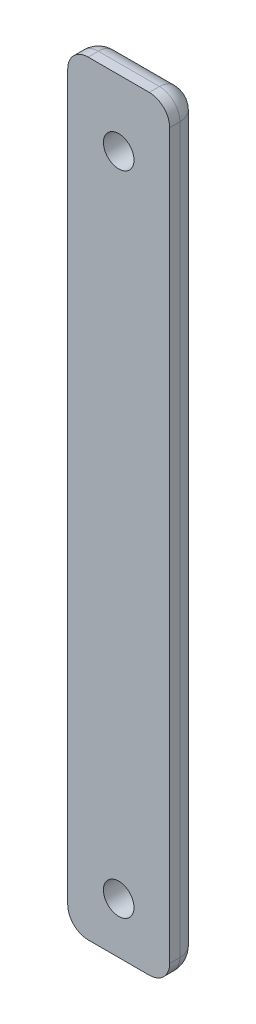
ISO-10303-21;
HEADER;
FILE_DESCRIPTION(('STEP AP214'),'2;1');
FILE_NAME('part.step','',(''),(''),'','','');
FILE_SCHEMA(('AUTOMOTIVE_DESIGN { 1 0 10303 214 1 1 1 1 }'));
ENDSEC;
DATA;
#1=APPLICATION_CONTEXT('core data for automotive mechanical design processes');
#2=APPLICATION_PROTOCOL_DEFINITION('international standard','automotive_design',2000,#1);
#3=PRODUCT_CONTEXT('',#1,'mechanical');
#4=PRODUCT('Part','Part','',(#3));
#5=PRODUCT_RELATED_PRODUCT_CATEGORY('part','',(#4));
#6=PRODUCT_DEFINITION_FORMATION('','',#4);
#7=PRODUCT_DEFINITION_CONTEXT('part definition',#1,'design');
#8=PRODUCT_DEFINITION('design','',#6,#7);
#9=PRODUCT_DEFINITION_SHAPE('','',#8);
#10=(LENGTH_UNIT() NAMED_UNIT(*) SI_UNIT(.MILLI.,.METRE.));
#11=(NAMED_UNIT(*) PLANE_ANGLE_UNIT() SI_UNIT($,.RADIAN.));
#12=(NAMED_UNIT(*) SI_UNIT($,.STERADIAN.) SOLID_ANGLE_UNIT());
#13=UNCERTAINTY_MEASURE_WITH_UNIT(LENGTH_MEASURE(1.E-05),#10,'distance_accuracy_value','');
#14=(GEOMETRIC_REPRESENTATION_CONTEXT(3) GLOBAL_UNCERTAINTY_ASSIGNED_CONTEXT((#13)) GLOBAL_UNIT_ASSIGNED_CONTEXT((#10,
#11,#12)) REPRESENTATION_CONTEXT('',''));
#15=CARTESIAN_POINT('',(0.,0.,0.));
#16=DIRECTION('',(0.,0.,1.));
#17=DIRECTION('',(1.,0.,0.));
#18=AXIS2_PLACEMENT_3D('',#15,#16,#17);
#19=CARTESIAN_POINT('',(4.99999999999999,37.5,1.5));
#20=DIRECTION('',(-1.,0.,0.));
#21=DIRECTION('',(0.,-1.,0.));
#22=AXIS2_PLACEMENT_3D('',#19,#20,#21);
#23=PLANE('',#22);
#24=DIRECTION('',(0.,1.,0.));
#25=VECTOR('',#24,1.);
#26=CARTESIAN_POINT('',(4.99999999999999,37.5,1.5));
#27=LINE('',#26,#25);
#28=CARTESIAN_POINT('',(5.,-35.5,1.5));
#29=VERTEX_POINT('',#28);
#30=CARTESIAN_POINT('',(4.99999999999999,35.5,1.5));
#31=VERTEX_POINT('',#30);
#32=EDGE_CURVE('E124',#29,#31,#27,.T.);
#33=ORIENTED_EDGE('',*,*,#32,.F.);
#34=DIRECTION('',(0.,0.,-1.));
#35=VECTOR('',#34,1.);
#36=CARTESIAN_POINT('',(5.,-35.5,1.5));
#37=LINE('',#36,#35);
#38=CARTESIAN_POINT('',(5.,-35.5,0.5));
#39=VERTEX_POINT('',#38);
#40=EDGE_CURVE('E56',#29,#39,#37,.T.);
#41=ORIENTED_EDGE('',*,*,#40,.T.);
#42=DIRECTION('',(0.,1.,0.));
#43=VECTOR('',#42,1.);
#44=CARTESIAN_POINT('',(4.99999999999999,37.5,0.5));
#45=LINE('',#44,#43);
#46=CARTESIAN_POINT('',(4.99999999999999,35.5,0.5));
#47=VERTEX_POINT('',#46);
#48=EDGE_CURVE('E61',#39,#47,#45,.T.);
#49=ORIENTED_EDGE('',*,*,#48,.T.);
#50=DIRECTION('',(0.,0.,-1.));
#51=VECTOR('',#50,1.);
#52=CARTESIAN_POINT('',(4.99999999999999,35.5,1.5));
#53=LINE('',#52,#51);
#54=EDGE_CURVE('E171',#47,#31,#53,.F.);
#55=ORIENTED_EDGE('',*,*,#54,.T.);
#56=EDGE_LOOP('',(#33,#41,#49,#55));
#57=FACE_BOUND('',#56,.T.);
#58=ADVANCED_FACE('F39',(#57),#23,.F.);
#59=CARTESIAN_POINT('',(-5.00000000000001,37.5,1.5));
#60=DIRECTION('',(0.,-1.,0.));
#61=DIRECTION('',(0.,0.,-1.));
#62=AXIS2_PLACEMENT_3D('',#59,#60,#61);
#63=PLANE('',#62);
#64=DIRECTION('',(-1.,0.,0.));
#65=VECTOR('',#64,1.);
#66=CARTESIAN_POINT('',(-5.00000000000001,37.5,0.5));
#67=LINE('',#66,#65);
#68=CARTESIAN_POINT('',(2.99999999999999,37.5,0.5));
#69=VERTEX_POINT('',#68);
#70=CARTESIAN_POINT('',(-3.00000000000001,37.5,0.5));
#71=VERTEX_POINT('',#70);
#72=EDGE_CURVE('E142',#69,#71,#67,.T.);
#73=ORIENTED_EDGE('',*,*,#72,.T.);
#74=DIRECTION('',(0.,0.,-1.));
#75=VECTOR('',#74,1.);
#76=CARTESIAN_POINT('',(-3.00000000000001,37.5,1.5));
#77=LINE('',#76,#75);
#78=CARTESIAN_POINT('',(-3.00000000000001,37.5,1.5));
#79=VERTEX_POINT('',#78);
#80=EDGE_CURVE('E135',#71,#79,#77,.F.);
#81=ORIENTED_EDGE('',*,*,#80,.T.);
#82=DIRECTION('',(-1.,0.,0.));
#83=VECTOR('',#82,1.);
#84=CARTESIAN_POINT('',(-5.00000000000001,37.5,1.5));
#85=LINE('',#84,#83);
#86=CARTESIAN_POINT('',(2.99999999999999,37.5,1.5));
#87=VERTEX_POINT('',#86);
#88=EDGE_CURVE('E122',#87,#79,#85,.T.);
#89=ORIENTED_EDGE('',*,*,#88,.F.);
#90=DIRECTION('',(0.,0.,-1.));
#91=VECTOR('',#90,1.);
#92=CARTESIAN_POINT('',(2.99999999999999,37.5,1.5));
#93=LINE('',#92,#91);
#94=EDGE_CURVE('E132',#87,#69,#93,.T.);
#95=ORIENTED_EDGE('',*,*,#94,.T.);
#96=EDGE_LOOP('',(#73,#81,#89,#95));
#97=FACE_BOUND('',#96,.T.);
#98=ADVANCED_FACE('F131',(#97),#63,.F.);
#99=CARTESIAN_POINT('',(-5.00000000000001,37.5,1.5));
#100=DIRECTION('',(1.,0.,0.));
#101=DIRECTION('',(0.,1.,0.));
#102=AXIS2_PLACEMENT_3D('',#99,#100,#101);
#103=PLANE('',#102);
#104=DIRECTION('',(0.,-1.,0.));
#105=VECTOR('',#104,1.);
#106=CARTESIAN_POINT('',(-5.00000000000001,37.5,1.5));
#107=LINE('',#106,#105);
#108=CARTESIAN_POINT('',(-5.00000000000001,35.5,1.5));
#109=VERTEX_POINT('',#108);
#110=CARTESIAN_POINT('',(-5.,-35.5,1.5));
#111=VERTEX_POINT('',#110);
#112=EDGE_CURVE('E136',#109,#111,#107,.T.);
#113=ORIENTED_EDGE('',*,*,#112,.F.);
#114=DIRECTION('',(0.,0.,-1.));
#115=VECTOR('',#114,1.);
#116=CARTESIAN_POINT('',(-5.00000000000001,35.5,1.5));
#117=LINE('',#116,#115);
#118=CARTESIAN_POINT('',(-5.00000000000001,35.5,0.5));
#119=VERTEX_POINT('',#118);
#120=EDGE_CURVE('E163',#109,#119,#117,.T.);
#121=ORIENTED_EDGE('',*,*,#120,.T.);
#122=DIRECTION('',(0.,-1.,0.));
#123=VECTOR('',#122,1.);
#124=CARTESIAN_POINT('',(-5.00000000000001,37.5,0.5));
#125=LINE('',#124,#123);
#126=CARTESIAN_POINT('',(-5.,-35.5,0.5));
#127=VERTEX_POINT('',#126);
#128=EDGE_CURVE('E161',#119,#127,#125,.T.);
#129=ORIENTED_EDGE('',*,*,#128,.T.);
#130=DIRECTION('',(0.,0.,-1.));
#131=VECTOR('',#130,1.);
#132=CARTESIAN_POINT('',(-5.,-35.5,1.5));
#133=LINE('',#132,#131);
#134=EDGE_CURVE('E159',#127,#111,#133,.F.);
#135=ORIENTED_EDGE('',*,*,#134,.T.);
#136=EDGE_LOOP('',(#113,#121,#129,#135));
#137=FACE_BOUND('',#136,.T.);
#138=ADVANCED_FACE('F266',(#137),#103,.F.);
#139=CARTESIAN_POINT('',(-5.,-37.5,1.5));
#140=DIRECTION('',(0.,1.,0.));
#141=DIRECTION('',(0.,0.,1.));
#142=AXIS2_PLACEMENT_3D('',#139,#140,#141);
#143=PLANE('',#142);
#144=DIRECTION('',(1.,0.,0.));
#145=VECTOR('',#144,1.);
#146=CARTESIAN_POINT('',(-5.,-37.5,0.5));
#147=LINE('',#146,#145);
#148=CARTESIAN_POINT('',(-3.,-37.5,0.5));
#149=VERTEX_POINT('',#148);
#150=CARTESIAN_POINT('',(3.,-37.5,0.5));
#151=VERTEX_POINT('',#150);
#152=EDGE_CURVE('E167',#149,#151,#147,.T.);
#153=ORIENTED_EDGE('',*,*,#152,.T.);
#154=DIRECTION('',(0.,0.,-1.));
#155=VECTOR('',#154,1.);
#156=CARTESIAN_POINT('',(3.,-37.5,1.5));
#157=LINE('',#156,#155);
#158=CARTESIAN_POINT('',(3.,-37.5,1.5));
#159=VERTEX_POINT('',#158);
#160=EDGE_CURVE('E169',#151,#159,#157,.F.);
#161=ORIENTED_EDGE('',*,*,#160,.T.);
#162=DIRECTION('',(1.,0.,0.));
#163=VECTOR('',#162,1.);
#164=CARTESIAN_POINT('',(-5.,-37.5,1.5));
#165=LINE('',#164,#163);
#166=CARTESIAN_POINT('',(-3.,-37.5,1.5));
#167=VERTEX_POINT('',#166);
#168=EDGE_CURVE('E143',#167,#159,#165,.T.);
#169=ORIENTED_EDGE('',*,*,#168,.F.);
#170=DIRECTION('',(0.,0.,-1.));
#171=VECTOR('',#170,1.);
#172=CARTESIAN_POINT('',(-3.,-37.5,1.5));
#173=LINE('',#172,#171);
#174=EDGE_CURVE('E165',#167,#149,#173,.T.);
#175=ORIENTED_EDGE('',*,*,#174,.T.);
#176=EDGE_LOOP('',(#153,#161,#169,#175));
#177=FACE_BOUND('',#176,.T.);
#178=ADVANCED_FACE('F235',(#177),#143,.F.);
#179=CARTESIAN_POINT('',(0.,0.,1.5));
#180=DIRECTION('',(0.,0.,1.));
#181=DIRECTION('',(1.,0.,0.));
#182=AXIS2_PLACEMENT_3D('',#179,#180,#181);
#183=PLANE('',#182);
#184=CARTESIAN_POINT('',(0.,31.,1.5));
#185=DIRECTION('',(0.,0.,1.));
#186=DIRECTION('',(1.,0.,0.));
#187=AXIS2_PLACEMENT_3D('',#184,#185,#186);
#188=CIRCLE('',#187,1.5);
#189=CARTESIAN_POINT('',(1.5,31.,1.5));
#190=VERTEX_POINT('',#189);
#191=EDGE_CURVE('E210',#190,#190,#188,.T.);
#192=ORIENTED_EDGE('',*,*,#191,.F.);
#193=EDGE_LOOP('',(#192));
#194=FACE_BOUND('',#193,.T.);
#195=CARTESIAN_POINT('',(0.,-32.5,1.5));
#196=DIRECTION('',(0.,0.,1.));
#197=DIRECTION('',(1.,0.,0.));
#198=AXIS2_PLACEMENT_3D('',#195,#196,#197);
#199=CIRCLE('',#198,1.5);
#200=CARTESIAN_POINT('',(1.5,-32.5,1.5));
#201=VERTEX_POINT('',#200);
#202=EDGE_CURVE('E215',#201,#201,#199,.T.);
#203=ORIENTED_EDGE('',*,*,#202,.F.);
#204=EDGE_LOOP('',(#203));
#205=FACE_BOUND('',#204,.T.);
#206=ORIENTED_EDGE('',*,*,#168,.T.);
#207=CARTESIAN_POINT('',(3.,-35.5,1.5));
#208=DIRECTION('',(0.,0.,1.));
#209=DIRECTION('',(1.,0.,0.));
#210=AXIS2_PLACEMENT_3D('',#207,#208,#209);
#211=CIRCLE('',#210,2.);
#212=EDGE_CURVE('E11',#159,#29,#211,.T.);
#213=ORIENTED_EDGE('',*,*,#212,.T.);
#214=ORIENTED_EDGE('',*,*,#32,.T.);
#215=CARTESIAN_POINT('',(2.99999999999999,35.5,1.5));
#216=DIRECTION('',(0.,0.,1.));
#217=DIRECTION('',(1.,0.,0.));
#218=AXIS2_PLACEMENT_3D('',#215,#216,#217);
#219=CIRCLE('',#218,2.);
#220=EDGE_CURVE('E118',#31,#87,#219,.T.);
#221=ORIENTED_EDGE('',*,*,#220,.T.);
#222=ORIENTED_EDGE('',*,*,#88,.T.);
#223=CARTESIAN_POINT('',(-3.00000000000001,35.5,1.5));
#224=DIRECTION('',(0.,0.,1.));
#225=DIRECTION('',(1.,0.,0.));
#226=AXIS2_PLACEMENT_3D('',#223,#224,#225);
#227=CIRCLE('',#226,2.);
#228=EDGE_CURVE('E48',#79,#109,#227,.T.);
#229=ORIENTED_EDGE('',*,*,#228,.T.);
#230=ORIENTED_EDGE('',*,*,#112,.T.);
#231=CARTESIAN_POINT('',(-3.,-35.5,1.5));
#232=DIRECTION('',(0.,0.,1.));
#233=DIRECTION('',(1.,0.,0.));
#234=AXIS2_PLACEMENT_3D('',#231,#232,#233);
#235=CIRCLE('',#234,2.);
#236=EDGE_CURVE('E127',#111,#167,#235,.T.);
#237=ORIENTED_EDGE('',*,*,#236,.T.);
#238=EDGE_LOOP('',(#206,#213,#214,#221,#222,#229,#230,#237));
#239=FACE_BOUND('',#238,.T.);
#240=ADVANCED_FACE('F121',(#194,#205,#239),#183,.T.);
#241=CARTESIAN_POINT('',(0.,0.,-1.5));
#242=DIRECTION('',(0.,0.,1.));
#243=DIRECTION('',(1.,0.,0.));
#244=AXIS2_PLACEMENT_3D('',#241,#242,#243);
#245=PLANE('',#244);
#246=CARTESIAN_POINT('',(0.,31.,-1.5));
#247=DIRECTION('',(0.,0.,1.));
#248=DIRECTION('',(1.,0.,0.));
#249=AXIS2_PLACEMENT_3D('',#246,#247,#248);
#250=CIRCLE('',#249,1.5);
#251=CARTESIAN_POINT('',(1.5,31.,-1.5));
#252=VERTEX_POINT('',#251);
#253=EDGE_CURVE('E43',#252,#252,#250,.T.);
#254=ORIENTED_EDGE('',*,*,#253,.T.);
#255=EDGE_LOOP('',(#254));
#256=FACE_BOUND('',#255,.T.);
#257=CARTESIAN_POINT('',(0.,-32.5,-1.5));
#258=DIRECTION('',(0.,0.,1.));
#259=DIRECTION('',(1.,0.,0.));
#260=AXIS2_PLACEMENT_3D('',#257,#258,#259);
#261=CIRCLE('',#260,1.5);
#262=CARTESIAN_POINT('',(1.5,-32.5,-1.5));
#263=VERTEX_POINT('',#262);
#264=EDGE_CURVE('E208',#263,#263,#261,.T.);
#265=ORIENTED_EDGE('',*,*,#264,.T.);
#266=EDGE_LOOP('',(#265));
#267=FACE_BOUND('',#266,.T.);
#268=DIRECTION('',(0.,-1.,0.));
#269=VECTOR('',#268,1.);
#270=CARTESIAN_POINT('',(-3.,0.,-1.5));
#271=LINE('',#270,#269);
#272=CARTESIAN_POINT('',(-3.,-35.5,-1.5));
#273=VERTEX_POINT('',#272);
#274=CARTESIAN_POINT('',(-3.00000000000001,35.5,-1.5));
#275=VERTEX_POINT('',#274);
#276=EDGE_CURVE('E154',#273,#275,#271,.F.);
#277=ORIENTED_EDGE('',*,*,#276,.T.);
#278=DIRECTION('',(-1.,0.,0.));
#279=VECTOR('',#278,1.);
#280=CARTESIAN_POINT('',(0.,35.5,-1.5));
#281=LINE('',#280,#279);
#282=CARTESIAN_POINT('',(2.99999999999999,35.5,-1.5));
#283=VERTEX_POINT('',#282);
#284=EDGE_CURVE('E156',#275,#283,#281,.F.);
#285=ORIENTED_EDGE('',*,*,#284,.T.);
#286=DIRECTION('',(0.,1.,0.));
#287=VECTOR('',#286,1.);
#288=CARTESIAN_POINT('',(3.,0.,-1.5));
#289=LINE('',#288,#287);
#290=CARTESIAN_POINT('',(3.,-35.5,-1.5));
#291=VERTEX_POINT('',#290);
#292=EDGE_CURVE('E150',#283,#291,#289,.F.);
#293=ORIENTED_EDGE('',*,*,#292,.T.);
#294=DIRECTION('',(1.,0.,0.));
#295=VECTOR('',#294,1.);
#296=CARTESIAN_POINT('',(0.,-35.5,-1.5));
#297=LINE('',#296,#295);
#298=EDGE_CURVE('E152',#291,#273,#297,.F.);
#299=ORIENTED_EDGE('',*,*,#298,.T.);
#300=EDGE_LOOP('',(#277,#285,#293,#299));
#301=FACE_BOUND('',#300,.T.);
#302=ADVANCED_FACE('F337',(#256,#267,#301),#245,.F.);
#303=CARTESIAN_POINT('',(3.,-35.5,1.5));
#304=DIRECTION('',(0.,0.,-1.));
#305=DIRECTION('',(-1.,0.,0.));
#306=AXIS2_PLACEMENT_3D('',#303,#304,#305);
#307=CYLINDRICAL_SURFACE('',#306,2.);
#308=ORIENTED_EDGE('',*,*,#212,.F.);
#309=ORIENTED_EDGE('',*,*,#160,.F.);
#310=CARTESIAN_POINT('',(3.,-35.5,0.5));
#311=DIRECTION('',(0.,0.,-1.));
#312=DIRECTION('',(-1.,0.,0.));
#313=AXIS2_PLACEMENT_3D('',#310,#311,#312);
#314=CIRCLE('',#313,2.);
#315=EDGE_CURVE('E203',#39,#151,#314,.T.);
#316=ORIENTED_EDGE('',*,*,#315,.F.);
#317=ORIENTED_EDGE('',*,*,#40,.F.);
#318=EDGE_LOOP('',(#308,#309,#316,#317));
#319=FACE_BOUND('',#318,.T.);
#320=ADVANCED_FACE('F41',(#319),#307,.T.);
#321=CARTESIAN_POINT('',(-3.,-35.5,1.5));
#322=DIRECTION('',(0.,0.,-1.));
#323=DIRECTION('',(-1.,0.,0.));
#324=AXIS2_PLACEMENT_3D('',#321,#322,#323);
#325=CYLINDRICAL_SURFACE('',#324,2.);
#326=ORIENTED_EDGE('',*,*,#236,.F.);
#327=ORIENTED_EDGE('',*,*,#134,.F.);
#328=CARTESIAN_POINT('',(-3.,-35.5,0.5));
#329=DIRECTION('',(0.,0.,-1.));
#330=DIRECTION('',(-1.,0.,0.));
#331=AXIS2_PLACEMENT_3D('',#328,#329,#330);
#332=CIRCLE('',#331,2.);
#333=EDGE_CURVE('E200',#149,#127,#332,.T.);
#334=ORIENTED_EDGE('',*,*,#333,.F.);
#335=ORIENTED_EDGE('',*,*,#174,.F.);
#336=EDGE_LOOP('',(#326,#327,#334,#335));
#337=FACE_BOUND('',#336,.T.);
#338=ADVANCED_FACE('F231',(#337),#325,.T.);
#339=CARTESIAN_POINT('',(-5.,-35.5,0.5));
#340=DIRECTION('',(1.,0.,0.));
#341=DIRECTION('',(0.,0.,-1.));
#342=AXIS2_PLACEMENT_3D('',#339,#340,#341);
#343=CYLINDRICAL_SURFACE('',#342,2.);
#344=CARTESIAN_POINT('',(3.,-35.5,0.5));
#345=DIRECTION('',(1.,0.,0.));
#346=DIRECTION('',(0.,0.,-1.));
#347=AXIS2_PLACEMENT_3D('',#344,#345,#346);
#348=CIRCLE('',#347,2.);
#349=EDGE_CURVE('E206',#151,#291,#348,.T.);
#350=ORIENTED_EDGE('',*,*,#349,.F.);
#351=ORIENTED_EDGE('',*,*,#152,.F.);
#352=CARTESIAN_POINT('',(-3.,-35.5,0.5));
#353=DIRECTION('',(-1.,0.,0.));
#354=DIRECTION('',(0.,0.,1.));
#355=AXIS2_PLACEMENT_3D('',#352,#353,#354);
#356=CIRCLE('',#355,2.);
#357=EDGE_CURVE('E197',#273,#149,#356,.T.);
#358=ORIENTED_EDGE('',*,*,#357,.F.);
#359=ORIENTED_EDGE('',*,*,#298,.F.);
#360=EDGE_LOOP('',(#350,#351,#358,#359));
#361=FACE_BOUND('',#360,.T.);
#362=ADVANCED_FACE('F240',(#361),#343,.T.);
#363=CARTESIAN_POINT('',(3.,-35.5,0.5));
#364=DIRECTION('',(0.,-1.,0.));
#365=DIRECTION('',(0.,0.,-1.));
#366=AXIS2_PLACEMENT_3D('',#363,#364,#365);
#367=SPHERICAL_SURFACE('',#366,2.);
#368=ORIENTED_EDGE('',*,*,#315,.T.);
#369=ORIENTED_EDGE('',*,*,#349,.T.);
#370=CARTESIAN_POINT('',(3.,-35.5,0.5));
#371=DIRECTION('',(0.,-1.,0.));
#372=DIRECTION('',(0.,0.,-1.));
#373=AXIS2_PLACEMENT_3D('',#370,#371,#372);
#374=CIRCLE('',#373,2.);
#375=EDGE_CURVE('E194',#39,#291,#374,.F.);
#376=ORIENTED_EDGE('',*,*,#375,.F.);
#377=EDGE_LOOP('',(#368,#369,#376));
#378=FACE_BOUND('',#377,.T.);
#379=ADVANCED_FACE('F245',(#378),#367,.T.);
#380=CARTESIAN_POINT('',(-3.,-35.5,0.5));
#381=DIRECTION('',(0.,-1.,0.));
#382=DIRECTION('',(0.,0.,-1.));
#383=AXIS2_PLACEMENT_3D('',#380,#381,#382);
#384=SPHERICAL_SURFACE('',#383,2.);
#385=ORIENTED_EDGE('',*,*,#357,.T.);
#386=ORIENTED_EDGE('',*,*,#333,.T.);
#387=CARTESIAN_POINT('',(-3.,-35.5,0.5));
#388=DIRECTION('',(0.,-1.,0.));
#389=DIRECTION('',(0.,0.,-1.));
#390=AXIS2_PLACEMENT_3D('',#387,#388,#389);
#391=CIRCLE('',#390,2.);
#392=EDGE_CURVE('E191',#273,#127,#391,.F.);
#393=ORIENTED_EDGE('',*,*,#392,.F.);
#394=EDGE_LOOP('',(#385,#386,#393));
#395=FACE_BOUND('',#394,.T.);
#396=ADVANCED_FACE('F271',(#395),#384,.T.);
#397=CARTESIAN_POINT('',(2.99999999999999,37.5,0.5));
#398=DIRECTION('',(0.,1.,0.));
#399=DIRECTION('',(-1.,0.,0.));
#400=AXIS2_PLACEMENT_3D('',#397,#398,#399);
#401=CYLINDRICAL_SURFACE('',#400,2.);
#402=ORIENTED_EDGE('',*,*,#375,.T.);
#403=ORIENTED_EDGE('',*,*,#292,.F.);
#404=CARTESIAN_POINT('',(2.99999999999999,35.5,0.5));
#405=DIRECTION('',(0.,1.,0.));
#406=DIRECTION('',(0.,0.,1.));
#407=AXIS2_PLACEMENT_3D('',#404,#405,#406);
#408=CIRCLE('',#407,2.);
#409=EDGE_CURVE('E188',#47,#283,#408,.T.);
#410=ORIENTED_EDGE('',*,*,#409,.F.);
#411=ORIENTED_EDGE('',*,*,#48,.F.);
#412=EDGE_LOOP('',(#402,#403,#410,#411));
#413=FACE_BOUND('',#412,.T.);
#414=ADVANCED_FACE('F251',(#413),#401,.T.);
#415=CARTESIAN_POINT('',(2.99999999999999,35.5,1.5));
#416=DIRECTION('',(0.,0.,-1.));
#417=DIRECTION('',(-1.,0.,0.));
#418=AXIS2_PLACEMENT_3D('',#415,#416,#417);
#419=CYLINDRICAL_SURFACE('',#418,2.);
#420=ORIENTED_EDGE('',*,*,#220,.F.);
#421=ORIENTED_EDGE('',*,*,#54,.F.);
#422=CARTESIAN_POINT('',(2.99999999999999,35.5,0.5));
#423=DIRECTION('',(0.,0.,-1.));
#424=DIRECTION('',(-1.,0.,0.));
#425=AXIS2_PLACEMENT_3D('',#422,#423,#424);
#426=CIRCLE('',#425,2.);
#427=EDGE_CURVE('E140',#69,#47,#426,.T.);
#428=ORIENTED_EDGE('',*,*,#427,.F.);
#429=ORIENTED_EDGE('',*,*,#94,.F.);
#430=EDGE_LOOP('',(#420,#421,#428,#429));
#431=FACE_BOUND('',#430,.T.);
#432=ADVANCED_FACE('F138',(#431),#419,.T.);
#433=CARTESIAN_POINT('',(-3.00000000000001,35.5,1.5));
#434=DIRECTION('',(0.,0.,-1.));
#435=DIRECTION('',(-1.,0.,0.));
#436=AXIS2_PLACEMENT_3D('',#433,#434,#435);
#437=CYLINDRICAL_SURFACE('',#436,2.);
#438=ORIENTED_EDGE('',*,*,#228,.F.);
#439=ORIENTED_EDGE('',*,*,#80,.F.);
#440=CARTESIAN_POINT('',(-3.00000000000001,35.5,0.5));
#441=DIRECTION('',(0.,0.,-1.));
#442=DIRECTION('',(-1.,0.,0.));
#443=AXIS2_PLACEMENT_3D('',#440,#441,#442);
#444=CIRCLE('',#443,2.);
#445=EDGE_CURVE('E184',#119,#71,#444,.T.);
#446=ORIENTED_EDGE('',*,*,#445,.F.);
#447=ORIENTED_EDGE('',*,*,#120,.F.);
#448=EDGE_LOOP('',(#438,#439,#446,#447));
#449=FACE_BOUND('',#448,.T.);
#450=ADVANCED_FACE('F264',(#449),#437,.T.);
#451=CARTESIAN_POINT('',(-3.00000000000001,37.5,0.5));
#452=DIRECTION('',(0.,-1.,0.));
#453=DIRECTION('',(1.,0.,0.));
#454=AXIS2_PLACEMENT_3D('',#451,#452,#453);
#455=CYLINDRICAL_SURFACE('',#454,2.);
#456=ORIENTED_EDGE('',*,*,#392,.T.);
#457=ORIENTED_EDGE('',*,*,#128,.F.);
#458=CARTESIAN_POINT('',(-3.00000000000001,35.5,0.5));
#459=DIRECTION('',(0.,1.,0.));
#460=DIRECTION('',(0.,0.,1.));
#461=AXIS2_PLACEMENT_3D('',#458,#459,#460);
#462=CIRCLE('',#461,2.);
#463=EDGE_CURVE('E181',#275,#119,#462,.T.);
#464=ORIENTED_EDGE('',*,*,#463,.F.);
#465=ORIENTED_EDGE('',*,*,#276,.F.);
#466=EDGE_LOOP('',(#456,#457,#464,#465));
#467=FACE_BOUND('',#466,.T.);
#468=ADVANCED_FACE('F268',(#467),#455,.T.);
#469=CARTESIAN_POINT('',(2.99999999999999,35.5,0.5));
#470=DIRECTION('',(1.,0.,0.));
#471=DIRECTION('',(0.,0.,-1.));
#472=AXIS2_PLACEMENT_3D('',#469,#470,#471);
#473=SPHERICAL_SURFACE('',#472,2.);
#474=ORIENTED_EDGE('',*,*,#427,.T.);
#475=ORIENTED_EDGE('',*,*,#409,.T.);
#476=CARTESIAN_POINT('',(2.99999999999999,35.5,0.5));
#477=DIRECTION('',(1.,0.,0.));
#478=DIRECTION('',(0.,0.,-1.));
#479=AXIS2_PLACEMENT_3D('',#476,#477,#478);
#480=CIRCLE('',#479,2.);
#481=EDGE_CURVE('E179',#69,#283,#480,.F.);
#482=ORIENTED_EDGE('',*,*,#481,.F.);
#483=EDGE_LOOP('',(#474,#475,#482));
#484=FACE_BOUND('',#483,.T.);
#485=ADVANCED_FACE('F253',(#484),#473,.T.);
#486=CARTESIAN_POINT('',(-3.00000000000001,35.5,0.5));
#487=DIRECTION('',(-1.,0.,0.));
#488=DIRECTION('',(0.,0.,1.));
#489=AXIS2_PLACEMENT_3D('',#486,#487,#488);
#490=SPHERICAL_SURFACE('',#489,2.);
#491=ORIENTED_EDGE('',*,*,#463,.T.);
#492=ORIENTED_EDGE('',*,*,#445,.T.);
#493=CARTESIAN_POINT('',(-3.00000000000001,35.5,0.5));
#494=DIRECTION('',(-1.,0.,0.));
#495=DIRECTION('',(0.,0.,1.));
#496=AXIS2_PLACEMENT_3D('',#493,#494,#495);
#497=CIRCLE('',#496,2.);
#498=EDGE_CURVE('E177',#275,#71,#497,.F.);
#499=ORIENTED_EDGE('',*,*,#498,.F.);
#500=EDGE_LOOP('',(#491,#492,#499));
#501=FACE_BOUND('',#500,.T.);
#502=ADVANCED_FACE('F261',(#501),#490,.T.);
#503=CARTESIAN_POINT('',(-5.00000000000001,35.5,0.5));
#504=DIRECTION('',(-1.,0.,0.));
#505=DIRECTION('',(0.,0.,1.));
#506=AXIS2_PLACEMENT_3D('',#503,#504,#505);
#507=CYLINDRICAL_SURFACE('',#506,2.);
#508=ORIENTED_EDGE('',*,*,#481,.T.);
#509=ORIENTED_EDGE('',*,*,#284,.F.);
#510=ORIENTED_EDGE('',*,*,#498,.T.);
#511=ORIENTED_EDGE('',*,*,#72,.F.);
#512=EDGE_LOOP('',(#508,#509,#510,#511));
#513=FACE_BOUND('',#512,.T.);
#514=ADVANCED_FACE('F257',(#513),#507,.T.);
#515=CARTESIAN_POINT('',(0.,-32.5,-8.5));
#516=DIRECTION('',(0.,0.,1.));
#517=DIRECTION('',(1.,0.,0.));
#518=AXIS2_PLACEMENT_3D('',#515,#516,#517);
#519=CYLINDRICAL_SURFACE('',#518,1.5);
#520=ORIENTED_EDGE('',*,*,#202,.T.);
#521=EDGE_LOOP('',(#520));
#522=FACE_BOUND('',#521,.T.);
#523=ORIENTED_EDGE('',*,*,#264,.F.);
#524=EDGE_LOOP('',(#523));
#525=FACE_BOUND('',#524,.T.);
#526=ADVANCED_FACE('F290',(#522,#525),#519,.F.);
#527=CARTESIAN_POINT('',(0.,31.,-8.5));
#528=DIRECTION('',(0.,0.,1.));
#529=DIRECTION('',(1.,0.,0.));
#530=AXIS2_PLACEMENT_3D('',#527,#528,#529);
#531=CYLINDRICAL_SURFACE('',#530,1.5);
#532=ORIENTED_EDGE('',*,*,#191,.T.);
#533=EDGE_LOOP('',(#532));
#534=FACE_BOUND('',#533,.T.);
#535=ORIENTED_EDGE('',*,*,#253,.F.);
#536=EDGE_LOOP('',(#535));
#537=FACE_BOUND('',#536,.T.);
#538=ADVANCED_FACE('F355',(#534,#537),#531,.F.);
#539=CLOSED_SHELL('',(#58,#98,#138,#178,#240,#302,#320,#338,#362,#379,#396,#414,#432,#450,#468,
#485,#502,#514,#526,#538));
#540=MANIFOLD_SOLID_BREP('B2',#539);
#541=ADVANCED_BREP_SHAPE_REPRESENTATION('',(#18,#540),#14);
#542=SHAPE_DEFINITION_REPRESENTATION(#9,#541);
ENDSEC;
END-ISO-10303-21;
